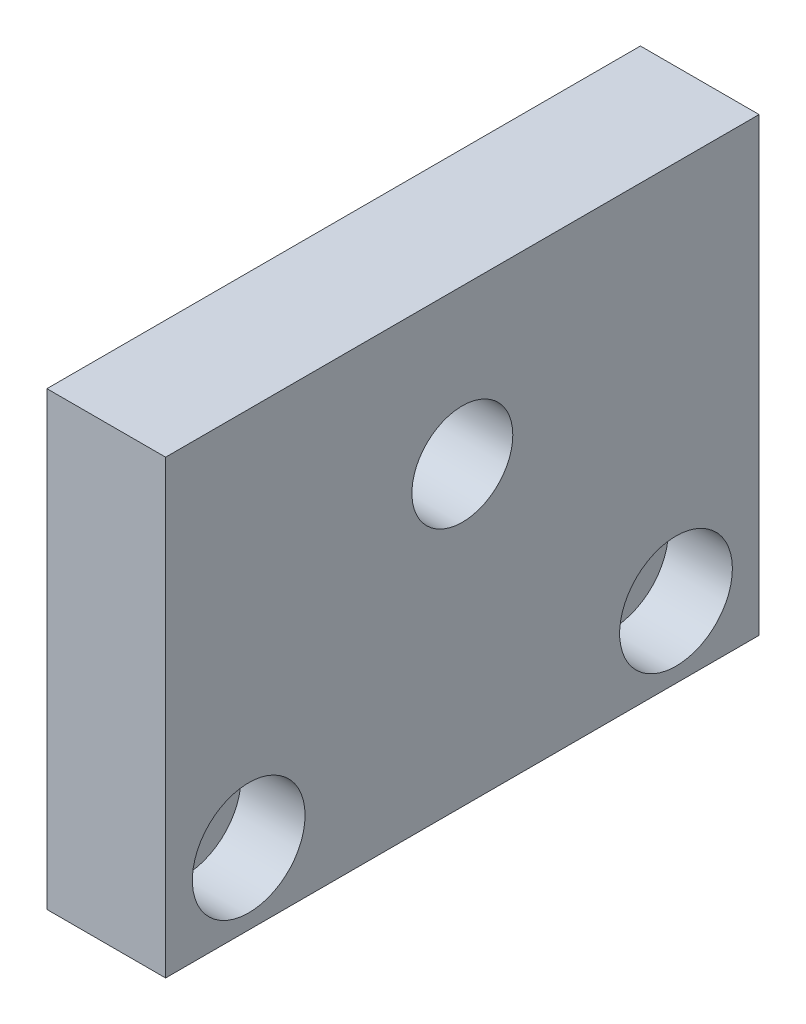
ISO-10303-21;
HEADER;
FILE_DESCRIPTION(('STEP AP214'),'2;1');
FILE_NAME('part.step','',(''),(''),'','','');
FILE_SCHEMA(('AUTOMOTIVE_DESIGN { 1 0 10303 214 1 1 1 1 }'));
ENDSEC;
DATA;
#1=APPLICATION_CONTEXT('core data for automotive mechanical design processes');
#2=APPLICATION_PROTOCOL_DEFINITION('international standard','automotive_design',2000,#1);
#3=PRODUCT_CONTEXT('',#1,'mechanical');
#4=PRODUCT('Part','Part','',(#3));
#5=PRODUCT_RELATED_PRODUCT_CATEGORY('part','',(#4));
#6=PRODUCT_DEFINITION_FORMATION('','',#4);
#7=PRODUCT_DEFINITION_CONTEXT('part definition',#1,'design');
#8=PRODUCT_DEFINITION('design','',#6,#7);
#9=PRODUCT_DEFINITION_SHAPE('','',#8);
#10=(LENGTH_UNIT() NAMED_UNIT(*) SI_UNIT(.MILLI.,.METRE.));
#11=(NAMED_UNIT(*) PLANE_ANGLE_UNIT() SI_UNIT($,.RADIAN.));
#12=(NAMED_UNIT(*) SI_UNIT($,.STERADIAN.) SOLID_ANGLE_UNIT());
#13=UNCERTAINTY_MEASURE_WITH_UNIT(LENGTH_MEASURE(1.E-05),#10,'distance_accuracy_value','');
#14=(GEOMETRIC_REPRESENTATION_CONTEXT(3) GLOBAL_UNCERTAINTY_ASSIGNED_CONTEXT((#13)) GLOBAL_UNIT_ASSIGNED_CONTEXT((#10,
#11,#12)) REPRESENTATION_CONTEXT('',''));
#15=CARTESIAN_POINT('',(0.,0.,0.));
#16=DIRECTION('',(0.,0.,1.));
#17=DIRECTION('',(1.,0.,0.));
#18=AXIS2_PLACEMENT_3D('',#15,#16,#17);
#19=CARTESIAN_POINT('',(10.,38.,25.));
#20=DIRECTION('',(0.,0.,-1.));
#21=DIRECTION('',(0.,1.,0.));
#22=AXIS2_PLACEMENT_3D('',#19,#20,#21);
#23=PLANE('',#22);
#24=DIRECTION('',(0.,-1.,0.));
#25=VECTOR('',#24,1.);
#26=CARTESIAN_POINT('',(0.,38.,25.));
#27=LINE('',#26,#25);
#28=CARTESIAN_POINT('',(0.,38.,25.));
#29=VERTEX_POINT('',#28);
#30=CARTESIAN_POINT('',(0.,0.,25.));
#31=VERTEX_POINT('',#30);
#32=EDGE_CURVE('E97',#29,#31,#27,.T.);
#33=ORIENTED_EDGE('',*,*,#32,.T.);
#34=DIRECTION('',(-1.,0.,0.));
#35=VECTOR('',#34,1.);
#36=CARTESIAN_POINT('',(10.,0.,25.));
#37=LINE('',#36,#35);
#38=CARTESIAN_POINT('',(10.,0.,25.));
#39=VERTEX_POINT('',#38);
#40=EDGE_CURVE('E11',#39,#31,#37,.T.);
#41=ORIENTED_EDGE('',*,*,#40,.F.);
#42=DIRECTION('',(0.,-1.,0.));
#43=VECTOR('',#42,1.);
#44=CARTESIAN_POINT('',(10.,38.,25.));
#45=LINE('',#44,#43);
#46=CARTESIAN_POINT('',(10.,38.,25.));
#47=VERTEX_POINT('',#46);
#48=EDGE_CURVE('E85',#47,#39,#45,.T.);
#49=ORIENTED_EDGE('',*,*,#48,.F.);
#50=DIRECTION('',(-1.,0.,0.));
#51=VECTOR('',#50,1.);
#52=CARTESIAN_POINT('',(10.,38.,25.));
#53=LINE('',#52,#51);
#54=EDGE_CURVE('E93',#47,#29,#53,.T.);
#55=ORIENTED_EDGE('',*,*,#54,.T.);
#56=EDGE_LOOP('',(#33,#41,#49,#55));
#57=FACE_BOUND('',#56,.T.);
#58=ADVANCED_FACE('F34',(#57),#23,.F.);
#59=CARTESIAN_POINT('',(10.,0.,25.));
#60=DIRECTION('',(0.,1.,0.));
#61=DIRECTION('',(0.,0.,1.));
#62=AXIS2_PLACEMENT_3D('',#59,#60,#61);
#63=PLANE('',#62);
#64=DIRECTION('',(0.,0.,-1.));
#65=VECTOR('',#64,1.);
#66=CARTESIAN_POINT('',(0.,0.,25.));
#67=LINE('',#66,#65);
#68=CARTESIAN_POINT('',(0.,0.,-25.));
#69=VERTEX_POINT('',#68);
#70=EDGE_CURVE('E89',#31,#69,#67,.T.);
#71=ORIENTED_EDGE('',*,*,#70,.T.);
#72=DIRECTION('',(-1.,0.,0.));
#73=VECTOR('',#72,1.);
#74=CARTESIAN_POINT('',(10.,0.,-25.));
#75=LINE('',#74,#73);
#76=CARTESIAN_POINT('',(10.,0.,-25.));
#77=VERTEX_POINT('',#76);
#78=EDGE_CURVE('E42',#77,#69,#75,.T.);
#79=ORIENTED_EDGE('',*,*,#78,.F.);
#80=DIRECTION('',(0.,0.,-1.));
#81=VECTOR('',#80,1.);
#82=CARTESIAN_POINT('',(10.,0.,25.));
#83=LINE('',#82,#81);
#84=EDGE_CURVE('E80',#39,#77,#83,.T.);
#85=ORIENTED_EDGE('',*,*,#84,.F.);
#86=ORIENTED_EDGE('',*,*,#40,.T.);
#87=EDGE_LOOP('',(#71,#79,#85,#86));
#88=FACE_BOUND('',#87,.T.);
#89=ADVANCED_FACE('F88',(#88),#63,.F.);
#90=CARTESIAN_POINT('',(10.,38.,-25.));
#91=DIRECTION('',(0.,0.,1.));
#92=DIRECTION('',(0.,-1.,0.));
#93=AXIS2_PLACEMENT_3D('',#90,#91,#92);
#94=PLANE('',#93);
#95=DIRECTION('',(0.,1.,0.));
#96=VECTOR('',#95,1.);
#97=CARTESIAN_POINT('',(0.,38.,-25.));
#98=LINE('',#97,#96);
#99=CARTESIAN_POINT('',(0.,38.,-25.));
#100=VERTEX_POINT('',#99);
#101=EDGE_CURVE('E67',#69,#100,#98,.T.);
#102=ORIENTED_EDGE('',*,*,#101,.T.);
#103=DIRECTION('',(-1.,0.,0.));
#104=VECTOR('',#103,1.);
#105=CARTESIAN_POINT('',(10.,38.,-25.));
#106=LINE('',#105,#104);
#107=CARTESIAN_POINT('',(10.,38.,-25.));
#108=VERTEX_POINT('',#107);
#109=EDGE_CURVE('E90',#108,#100,#106,.T.);
#110=ORIENTED_EDGE('',*,*,#109,.F.);
#111=DIRECTION('',(0.,1.,0.));
#112=VECTOR('',#111,1.);
#113=CARTESIAN_POINT('',(10.,38.,-25.));
#114=LINE('',#113,#112);
#115=EDGE_CURVE('E83',#77,#108,#114,.T.);
#116=ORIENTED_EDGE('',*,*,#115,.F.);
#117=ORIENTED_EDGE('',*,*,#78,.T.);
#118=EDGE_LOOP('',(#102,#110,#116,#117));
#119=FACE_BOUND('',#118,.T.);
#120=ADVANCED_FACE('F91',(#119),#94,.F.);
#121=CARTESIAN_POINT('',(10.,38.,25.));
#122=DIRECTION('',(0.,-1.,0.));
#123=DIRECTION('',(0.,0.,-1.));
#124=AXIS2_PLACEMENT_3D('',#121,#122,#123);
#125=PLANE('',#124);
#126=DIRECTION('',(0.,0.,1.));
#127=VECTOR('',#126,1.);
#128=CARTESIAN_POINT('',(0.,38.,25.));
#129=LINE('',#128,#127);
#130=EDGE_CURVE('E73',#100,#29,#129,.T.);
#131=ORIENTED_EDGE('',*,*,#130,.T.);
#132=ORIENTED_EDGE('',*,*,#54,.F.);
#133=DIRECTION('',(0.,0.,1.));
#134=VECTOR('',#133,1.);
#135=CARTESIAN_POINT('',(10.,38.,25.));
#136=LINE('',#135,#134);
#137=EDGE_CURVE('E50',#108,#47,#136,.T.);
#138=ORIENTED_EDGE('',*,*,#137,.F.);
#139=ORIENTED_EDGE('',*,*,#109,.T.);
#140=EDGE_LOOP('',(#131,#132,#138,#139));
#141=FACE_BOUND('',#140,.T.);
#142=ADVANCED_FACE('F105',(#141),#125,.F.);
#143=CARTESIAN_POINT('',(10.,0.,25.));
#144=DIRECTION('',(1.,0.,0.));
#145=DIRECTION('',(0.,0.,-1.));
#146=AXIS2_PLACEMENT_3D('',#143,#144,#145);
#147=PLANE('',#146);
#148=CARTESIAN_POINT('',(10.,6.,-18.));
#149=DIRECTION('',(1.,0.,0.));
#150=DIRECTION('',(0.,0.,-1.));
#151=AXIS2_PLACEMENT_3D('',#148,#149,#150);
#152=CIRCLE('',#151,4.75);
#153=CARTESIAN_POINT('',(10.,6.,-22.75));
#154=VERTEX_POINT('',#153);
#155=EDGE_CURVE('E137',#154,#154,#152,.T.);
#156=ORIENTED_EDGE('',*,*,#155,.F.);
#157=EDGE_LOOP('',(#156));
#158=FACE_BOUND('',#157,.T.);
#159=CARTESIAN_POINT('',(10.,6.,18.));
#160=DIRECTION('',(1.,0.,0.));
#161=DIRECTION('',(0.,0.,-1.));
#162=AXIS2_PLACEMENT_3D('',#159,#160,#161);
#163=CIRCLE('',#162,4.75);
#164=CARTESIAN_POINT('',(10.,6.,13.25));
#165=VERTEX_POINT('',#164);
#166=EDGE_CURVE('E125',#165,#165,#163,.T.);
#167=ORIENTED_EDGE('',*,*,#166,.F.);
#168=EDGE_LOOP('',(#167));
#169=FACE_BOUND('',#168,.T.);
#170=CARTESIAN_POINT('',(10.,25.,0.));
#171=DIRECTION('',(1.,0.,0.));
#172=DIRECTION('',(0.,0.,-1.));
#173=AXIS2_PLACEMENT_3D('',#170,#171,#172);
#174=CIRCLE('',#173,4.24999999999999);
#175=CARTESIAN_POINT('',(10.,25.,-4.24999999999999));
#176=VERTEX_POINT('',#175);
#177=EDGE_CURVE('E113',#176,#176,#174,.T.);
#178=ORIENTED_EDGE('',*,*,#177,.F.);
#179=EDGE_LOOP('',(#178));
#180=FACE_BOUND('',#179,.T.);
#181=ORIENTED_EDGE('',*,*,#48,.T.);
#182=ORIENTED_EDGE('',*,*,#84,.T.);
#183=ORIENTED_EDGE('',*,*,#115,.T.);
#184=ORIENTED_EDGE('',*,*,#137,.T.);
#185=EDGE_LOOP('',(#181,#182,#183,#184));
#186=FACE_BOUND('',#185,.T.);
#187=ADVANCED_FACE('F81',(#158,#169,#180,#186),#147,.T.);
#188=CARTESIAN_POINT('',(0.,0.,25.));
#189=DIRECTION('',(1.,0.,0.));
#190=DIRECTION('',(0.,0.,-1.));
#191=AXIS2_PLACEMENT_3D('',#188,#189,#190);
#192=PLANE('',#191);
#193=CARTESIAN_POINT('',(0.,6.,-18.));
#194=DIRECTION('',(1.,0.,0.));
#195=DIRECTION('',(0.,0.,-1.));
#196=AXIS2_PLACEMENT_3D('',#193,#194,#195);
#197=CIRCLE('',#196,2.75);
#198=CARTESIAN_POINT('',(0.,6.,-20.75));
#199=VERTEX_POINT('',#198);
#200=EDGE_CURVE('E128',#199,#199,#197,.T.);
#201=ORIENTED_EDGE('',*,*,#200,.T.);
#202=EDGE_LOOP('',(#201));
#203=FACE_BOUND('',#202,.T.);
#204=CARTESIAN_POINT('',(0.,6.,18.));
#205=DIRECTION('',(1.,0.,0.));
#206=DIRECTION('',(0.,0.,-1.));
#207=AXIS2_PLACEMENT_3D('',#204,#205,#206);
#208=CIRCLE('',#207,2.75);
#209=CARTESIAN_POINT('',(0.,6.,15.25));
#210=VERTEX_POINT('',#209);
#211=EDGE_CURVE('E116',#210,#210,#208,.T.);
#212=ORIENTED_EDGE('',*,*,#211,.T.);
#213=EDGE_LOOP('',(#212));
#214=FACE_BOUND('',#213,.T.);
#215=CARTESIAN_POINT('',(0.,25.,0.));
#216=DIRECTION('',(1.,0.,0.));
#217=DIRECTION('',(0.,0.,-1.));
#218=AXIS2_PLACEMENT_3D('',#215,#216,#217);
#219=CIRCLE('',#218,4.25);
#220=CARTESIAN_POINT('',(0.,25.,-4.25));
#221=VERTEX_POINT('',#220);
#222=EDGE_CURVE('E100',#221,#221,#219,.T.);
#223=ORIENTED_EDGE('',*,*,#222,.T.);
#224=EDGE_LOOP('',(#223));
#225=FACE_BOUND('',#224,.T.);
#226=ORIENTED_EDGE('',*,*,#32,.F.);
#227=ORIENTED_EDGE('',*,*,#130,.F.);
#228=ORIENTED_EDGE('',*,*,#101,.F.);
#229=ORIENTED_EDGE('',*,*,#70,.F.);
#230=EDGE_LOOP('',(#226,#227,#228,#229));
#231=FACE_BOUND('',#230,.T.);
#232=ADVANCED_FACE('F108',(#203,#214,#225,#231),#192,.F.);
#233=CARTESIAN_POINT('',(10.,25.,0.));
#234=DIRECTION('',(1.,0.,0.));
#235=DIRECTION('',(0.,0.,-1.));
#236=AXIS2_PLACEMENT_3D('',#233,#234,#235);
#237=CYLINDRICAL_SURFACE('',#236,4.24999999999999);
#238=ORIENTED_EDGE('',*,*,#222,.F.);
#239=EDGE_LOOP('',(#238));
#240=FACE_BOUND('',#239,.T.);
#241=ORIENTED_EDGE('',*,*,#177,.T.);
#242=EDGE_LOOP('',(#241));
#243=FACE_BOUND('',#242,.T.);
#244=ADVANCED_FACE('F150',(#240,#243),#237,.F.);
#245=CARTESIAN_POINT('',(10.,6.,18.));
#246=DIRECTION('',(1.,0.,0.));
#247=DIRECTION('',(0.,0.,-1.));
#248=AXIS2_PLACEMENT_3D('',#245,#246,#247);
#249=CYLINDRICAL_SURFACE('',#248,2.75);
#250=ORIENTED_EDGE('',*,*,#211,.F.);
#251=EDGE_LOOP('',(#250));
#252=FACE_BOUND('',#251,.T.);
#253=CARTESIAN_POINT('',(4.6,6.,18.));
#254=DIRECTION('',(1.,0.,0.));
#255=DIRECTION('',(0.,0.,-1.));
#256=AXIS2_PLACEMENT_3D('',#253,#254,#255);
#257=CIRCLE('',#256,2.75);
#258=CARTESIAN_POINT('',(4.6,6.,15.25));
#259=VERTEX_POINT('',#258);
#260=EDGE_CURVE('E119',#259,#259,#257,.T.);
#261=ORIENTED_EDGE('',*,*,#260,.T.);
#262=EDGE_LOOP('',(#261));
#263=FACE_BOUND('',#262,.T.);
#264=ADVANCED_FACE('F152',(#252,#263),#249,.F.);
#265=CARTESIAN_POINT('',(4.6,8.75,18.));
#266=DIRECTION('',(-1.,0.,0.));
#267=DIRECTION('',(0.,0.,1.));
#268=AXIS2_PLACEMENT_3D('',#265,#266,#267);
#269=PLANE('',#268);
#270=ORIENTED_EDGE('',*,*,#260,.F.);
#271=EDGE_LOOP('',(#270));
#272=FACE_BOUND('',#271,.T.);
#273=CARTESIAN_POINT('',(4.6,6.,18.));
#274=DIRECTION('',(1.,0.,0.));
#275=DIRECTION('',(0.,0.,-1.));
#276=AXIS2_PLACEMENT_3D('',#273,#274,#275);
#277=CIRCLE('',#276,4.75);
#278=CARTESIAN_POINT('',(4.6,6.,13.25));
#279=VERTEX_POINT('',#278);
#280=EDGE_CURVE('E122',#279,#279,#277,.T.);
#281=ORIENTED_EDGE('',*,*,#280,.T.);
#282=EDGE_LOOP('',(#281));
#283=FACE_BOUND('',#282,.T.);
#284=ADVANCED_FACE('F159',(#272,#283),#269,.F.);
#285=CARTESIAN_POINT('',(10.,6.,18.));
#286=DIRECTION('',(1.,0.,0.));
#287=DIRECTION('',(0.,0.,-1.));
#288=AXIS2_PLACEMENT_3D('',#285,#286,#287);
#289=CYLINDRICAL_SURFACE('',#288,4.75);
#290=ORIENTED_EDGE('',*,*,#280,.F.);
#291=EDGE_LOOP('',(#290));
#292=FACE_BOUND('',#291,.T.);
#293=ORIENTED_EDGE('',*,*,#166,.T.);
#294=EDGE_LOOP('',(#293));
#295=FACE_BOUND('',#294,.T.);
#296=ADVANCED_FACE('F204',(#292,#295),#289,.F.);
#297=CARTESIAN_POINT('',(10.,6.,-18.));
#298=DIRECTION('',(1.,0.,0.));
#299=DIRECTION('',(0.,0.,-1.));
#300=AXIS2_PLACEMENT_3D('',#297,#298,#299);
#301=CYLINDRICAL_SURFACE('',#300,2.75);
#302=ORIENTED_EDGE('',*,*,#200,.F.);
#303=EDGE_LOOP('',(#302));
#304=FACE_BOUND('',#303,.T.);
#305=CARTESIAN_POINT('',(4.6,6.,-18.));
#306=DIRECTION('',(1.,0.,0.));
#307=DIRECTION('',(0.,0.,-1.));
#308=AXIS2_PLACEMENT_3D('',#305,#306,#307);
#309=CIRCLE('',#308,2.75);
#310=CARTESIAN_POINT('',(4.6,6.,-20.75));
#311=VERTEX_POINT('',#310);
#312=EDGE_CURVE('E131',#311,#311,#309,.T.);
#313=ORIENTED_EDGE('',*,*,#312,.T.);
#314=EDGE_LOOP('',(#313));
#315=FACE_BOUND('',#314,.T.);
#316=ADVANCED_FACE('F214',(#304,#315),#301,.F.);
#317=CARTESIAN_POINT('',(4.6,8.75,-18.));
#318=DIRECTION('',(-1.,0.,0.));
#319=DIRECTION('',(0.,0.,1.));
#320=AXIS2_PLACEMENT_3D('',#317,#318,#319);
#321=PLANE('',#320);
#322=ORIENTED_EDGE('',*,*,#312,.F.);
#323=EDGE_LOOP('',(#322));
#324=FACE_BOUND('',#323,.T.);
#325=CARTESIAN_POINT('',(4.6,6.,-18.));
#326=DIRECTION('',(1.,0.,0.));
#327=DIRECTION('',(0.,0.,-1.));
#328=AXIS2_PLACEMENT_3D('',#325,#326,#327);
#329=CIRCLE('',#328,4.75);
#330=CARTESIAN_POINT('',(4.6,6.,-22.75));
#331=VERTEX_POINT('',#330);
#332=EDGE_CURVE('E134',#331,#331,#329,.T.);
#333=ORIENTED_EDGE('',*,*,#332,.T.);
#334=EDGE_LOOP('',(#333));
#335=FACE_BOUND('',#334,.T.);
#336=ADVANCED_FACE('F224',(#324,#335),#321,.F.);
#337=CARTESIAN_POINT('',(10.,6.,-18.));
#338=DIRECTION('',(1.,0.,0.));
#339=DIRECTION('',(0.,0.,-1.));
#340=AXIS2_PLACEMENT_3D('',#337,#338,#339);
#341=CYLINDRICAL_SURFACE('',#340,4.75);
#342=ORIENTED_EDGE('',*,*,#332,.F.);
#343=EDGE_LOOP('',(#342));
#344=FACE_BOUND('',#343,.T.);
#345=ORIENTED_EDGE('',*,*,#155,.T.);
#346=EDGE_LOOP('',(#345));
#347=FACE_BOUND('',#346,.T.);
#348=ADVANCED_FACE('F141',(#344,#347),#341,.F.);
#349=CLOSED_SHELL('',(#58,#89,#120,#142,#187,#232,#244,#264,#284,#296,#316,#336,#348));
#350=MANIFOLD_SOLID_BREP('B2',#349);
#351=ADVANCED_BREP_SHAPE_REPRESENTATION('',(#18,#350),#14);
#352=SHAPE_DEFINITION_REPRESENTATION(#9,#351);
ENDSEC;
END-ISO-10303-21;
